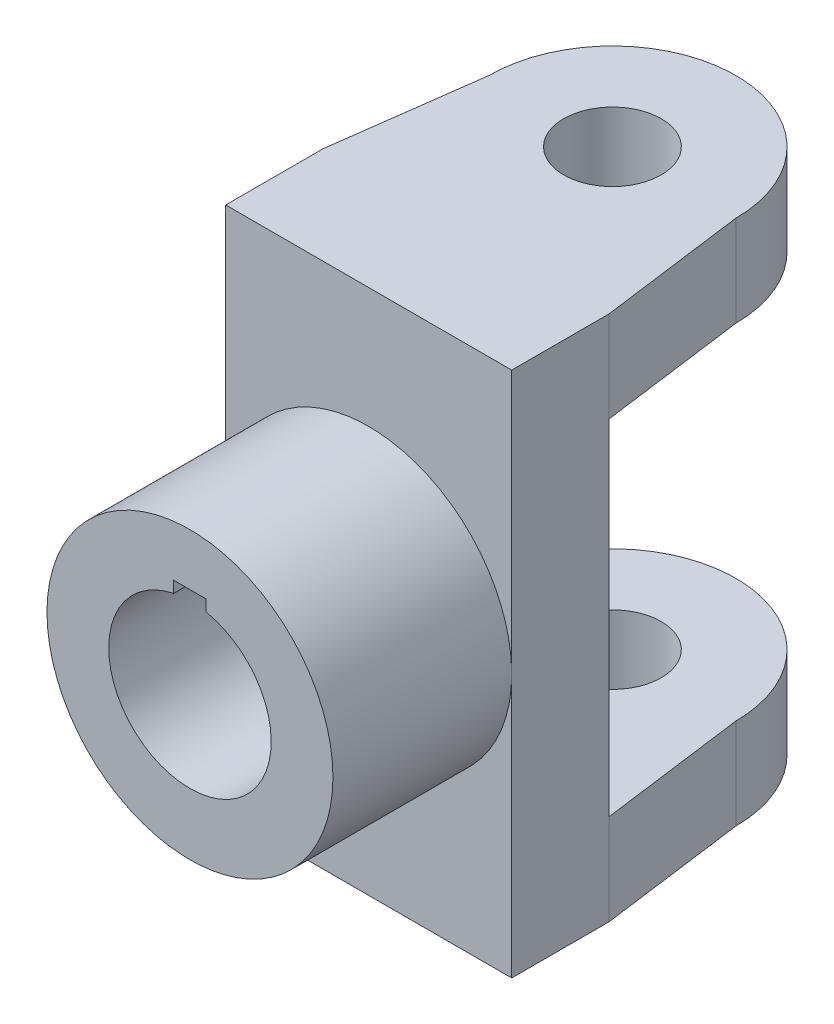
ISO-10303-21;
HEADER;
FILE_DESCRIPTION(('STEP AP214'),'2;1');
FILE_NAME('part.step','',(''),(''),'','','');
FILE_SCHEMA(('AUTOMOTIVE_DESIGN { 1 0 10303 214 1 1 1 1 }'));
ENDSEC;
DATA;
#1=APPLICATION_CONTEXT('core data for automotive mechanical design processes');
#2=APPLICATION_PROTOCOL_DEFINITION('international standard','automotive_design',2000,#1);
#3=PRODUCT_CONTEXT('',#1,'mechanical');
#4=PRODUCT('Part','Part','',(#3));
#5=PRODUCT_RELATED_PRODUCT_CATEGORY('part','',(#4));
#6=PRODUCT_DEFINITION_FORMATION('','',#4);
#7=PRODUCT_DEFINITION_CONTEXT('part definition',#1,'design');
#8=PRODUCT_DEFINITION('design','',#6,#7);
#9=PRODUCT_DEFINITION_SHAPE('','',#8);
#10=(LENGTH_UNIT() NAMED_UNIT(*) SI_UNIT(.MILLI.,.METRE.));
#11=(NAMED_UNIT(*) PLANE_ANGLE_UNIT() SI_UNIT($,.RADIAN.));
#12=(NAMED_UNIT(*) SI_UNIT($,.STERADIAN.) SOLID_ANGLE_UNIT());
#13=UNCERTAINTY_MEASURE_WITH_UNIT(LENGTH_MEASURE(1.E-05),#10,'distance_accuracy_value','');
#14=(GEOMETRIC_REPRESENTATION_CONTEXT(3) GLOBAL_UNCERTAINTY_ASSIGNED_CONTEXT((#13)) GLOBAL_UNIT_ASSIGNED_CONTEXT((#10,
#11,#12)) REPRESENTATION_CONTEXT('',''));
#15=CARTESIAN_POINT('',(0.,0.,0.));
#16=DIRECTION('',(0.,0.,1.));
#17=DIRECTION('',(1.,0.,0.));
#18=AXIS2_PLACEMENT_3D('',#15,#16,#17);
#19=CARTESIAN_POINT('',(0.,0.,0.));
#20=DIRECTION('',(0.,0.,1.));
#21=DIRECTION('',(1.,0.,0.));
#22=AXIS2_PLACEMENT_3D('',#19,#20,#21);
#23=PLANE('',#22);
#24=DIRECTION('',(-1.,0.,0.));
#25=VECTOR('',#24,1.);
#26=CARTESIAN_POINT('',(-44.,53.,0.));
#27=LINE('',#26,#25);
#28=CARTESIAN_POINT('',(44.,53.,0.));
#29=VERTEX_POINT('',#28);
#30=CARTESIAN_POINT('',(-44.,53.,0.));
#31=VERTEX_POINT('',#30);
#32=EDGE_CURVE('E165',#29,#31,#27,.T.);
#33=ORIENTED_EDGE('',*,*,#32,.F.);
#34=DIRECTION('',(0.,1.,0.));
#35=VECTOR('',#34,1.);
#36=CARTESIAN_POINT('',(44.,81.,0.));
#37=LINE('',#36,#35);
#38=CARTESIAN_POINT('',(44.,-53.,0.));
#39=VERTEX_POINT('',#38);
#40=EDGE_CURVE('E251',#39,#29,#37,.T.);
#41=ORIENTED_EDGE('',*,*,#40,.F.);
#42=DIRECTION('',(-1.,0.,0.));
#43=VECTOR('',#42,1.);
#44=CARTESIAN_POINT('',(-44.,-53.,0.));
#45=LINE('',#44,#43);
#46=CARTESIAN_POINT('',(-44.,-53.,0.));
#47=VERTEX_POINT('',#46);
#48=EDGE_CURVE('E196',#39,#47,#45,.T.);
#49=ORIENTED_EDGE('',*,*,#48,.T.);
#50=DIRECTION('',(0.,-1.,0.));
#51=VECTOR('',#50,1.);
#52=CARTESIAN_POINT('',(-44.,81.,0.));
#53=LINE('',#52,#51);
#54=EDGE_CURVE('E62',#31,#47,#53,.T.);
#55=ORIENTED_EDGE('',*,*,#54,.F.);
#56=EDGE_LOOP('',(#33,#41,#49,#55));
#57=FACE_BOUND('',#56,.T.);
#58=ADVANCED_FACE('F37',(#57),#23,.F.);
#59=CARTESIAN_POINT('',(0.,0.,30.));
#60=DIRECTION('',(0.,0.,1.));
#61=DIRECTION('',(1.,0.,0.));
#62=AXIS2_PLACEMENT_3D('',#59,#60,#61);
#63=PLANE('',#62);
#64=CARTESIAN_POINT('',(0.,0.,30.));
#65=DIRECTION('',(0.,0.,1.));
#66=DIRECTION('',(1.,0.,0.));
#67=AXIS2_PLACEMENT_3D('',#64,#65,#66);
#68=CIRCLE('',#67,44.);
#69=CARTESIAN_POINT('',(44.,0.,30.));
#70=VERTEX_POINT('',#69);
#71=CARTESIAN_POINT('',(-44.,0.,30.));
#72=VERTEX_POINT('',#71);
#73=EDGE_CURVE('E47',#70,#72,#68,.T.);
#74=ORIENTED_EDGE('',*,*,#73,.F.);
#75=DIRECTION('',(0.,1.,0.));
#76=VECTOR('',#75,1.);
#77=CARTESIAN_POINT('',(44.,81.,30.));
#78=LINE('',#77,#76);
#79=CARTESIAN_POINT('',(44.,81.,30.));
#80=VERTEX_POINT('',#79);
#81=EDGE_CURVE('E257',#70,#80,#78,.T.);
#82=ORIENTED_EDGE('',*,*,#81,.T.);
#83=DIRECTION('',(-1.,0.,0.));
#84=VECTOR('',#83,1.);
#85=CARTESIAN_POINT('',(-44.,81.,30.));
#86=LINE('',#85,#84);
#87=CARTESIAN_POINT('',(-44.,81.,30.));
#88=VERTEX_POINT('',#87);
#89=EDGE_CURVE('E256',#80,#88,#86,.T.);
#90=ORIENTED_EDGE('',*,*,#89,.T.);
#91=DIRECTION('',(0.,-1.,0.));
#92=VECTOR('',#91,1.);
#93=CARTESIAN_POINT('',(-44.,81.,30.));
#94=LINE('',#93,#92);
#95=EDGE_CURVE('E260',#88,#72,#94,.T.);
#96=ORIENTED_EDGE('',*,*,#95,.T.);
#97=EDGE_LOOP('',(#74,#82,#90,#96));
#98=FACE_BOUND('',#97,.T.);
#99=ADVANCED_FACE('F298',(#98),#63,.T.);
#100=CARTESIAN_POINT('',(44.,81.,30.));
#101=DIRECTION('',(-1.,0.,0.));
#102=DIRECTION('',(0.,-1.,0.));
#103=AXIS2_PLACEMENT_3D('',#100,#101,#102);
#104=PLANE('',#103);
#105=CARTESIAN_POINT('',(44.,-81.,0.));
#106=VERTEX_POINT('',#105);
#107=EDGE_CURVE('E266',#106,#39,#37,.T.);
#108=ORIENTED_EDGE('',*,*,#107,.T.);
#109=ORIENTED_EDGE('',*,*,#40,.T.);
#110=DIRECTION('',(0.,1.,0.));
#111=VECTOR('',#110,1.);
#112=CARTESIAN_POINT('',(44.,53.,0.));
#113=LINE('',#112,#111);
#114=CARTESIAN_POINT('',(44.,81.,0.));
#115=VERTEX_POINT('',#114);
#116=EDGE_CURVE('E169',#29,#115,#113,.T.);
#117=ORIENTED_EDGE('',*,*,#116,.T.);
#118=DIRECTION('',(0.,0.,-1.));
#119=VECTOR('',#118,1.);
#120=CARTESIAN_POINT('',(44.,81.,30.));
#121=LINE('',#120,#119);
#122=EDGE_CURVE('E41',#80,#115,#121,.T.);
#123=ORIENTED_EDGE('',*,*,#122,.F.);
#124=ORIENTED_EDGE('',*,*,#81,.F.);
#125=CARTESIAN_POINT('',(44.,-81.,30.));
#126=VERTEX_POINT('',#125);
#127=EDGE_CURVE('E254',#126,#70,#78,.T.);
#128=ORIENTED_EDGE('',*,*,#127,.F.);
#129=DIRECTION('',(0.,0.,-1.));
#130=VECTOR('',#129,1.);
#131=CARTESIAN_POINT('',(44.,-81.,30.));
#132=LINE('',#131,#130);
#133=EDGE_CURVE('E265',#126,#106,#132,.T.);
#134=ORIENTED_EDGE('',*,*,#133,.T.);
#135=EDGE_LOOP('',(#108,#109,#117,#123,#124,#128,#134));
#136=FACE_BOUND('',#135,.T.);
#137=ADVANCED_FACE('F39',(#136),#104,.F.);
#138=CARTESIAN_POINT('',(-44.,81.,30.));
#139=DIRECTION('',(0.,-1.,0.));
#140=DIRECTION('',(0.,0.,-1.));
#141=AXIS2_PLACEMENT_3D('',#138,#139,#140);
#142=PLANE('',#141);
#143=ORIENTED_EDGE('',*,*,#122,.T.);
#144=DIRECTION('',(0.132163720091018,0.,0.991227900682635));
#145=VECTOR('',#144,1.);
#146=CARTESIAN_POINT('',(44.,81.,0.));
#147=LINE('',#146,#145);
#148=CARTESIAN_POINT('',(38.,81.,-45.));
#149=VERTEX_POINT('',#148);
#150=EDGE_CURVE('E180',#149,#115,#147,.T.);
#151=ORIENTED_EDGE('',*,*,#150,.F.);
#152=CARTESIAN_POINT('',(0.,81.,-45.));
#153=DIRECTION('',(0.,-1.,0.));
#154=DIRECTION('',(0.,0.,-1.));
#155=AXIS2_PLACEMENT_3D('',#152,#153,#154);
#156=CIRCLE('',#155,38.);
#157=CARTESIAN_POINT('',(-38.,81.,-45.));
#158=VERTEX_POINT('',#157);
#159=EDGE_CURVE('E161',#158,#149,#156,.T.);
#160=ORIENTED_EDGE('',*,*,#159,.F.);
#161=DIRECTION('',(0.132163720091018,0.,-0.991227900682635));
#162=VECTOR('',#161,1.);
#163=CARTESIAN_POINT('',(-44.,81.,0.));
#164=LINE('',#163,#162);
#165=CARTESIAN_POINT('',(-44.,81.,0.));
#166=VERTEX_POINT('',#165);
#167=EDGE_CURVE('E171',#166,#158,#164,.T.);
#168=ORIENTED_EDGE('',*,*,#167,.F.);
#169=DIRECTION('',(0.,0.,-1.));
#170=VECTOR('',#169,1.);
#171=CARTESIAN_POINT('',(-44.,81.,30.));
#172=LINE('',#171,#170);
#173=EDGE_CURVE('E275',#88,#166,#172,.T.);
#174=ORIENTED_EDGE('',*,*,#173,.F.);
#175=ORIENTED_EDGE('',*,*,#89,.F.);
#176=EDGE_LOOP('',(#143,#151,#160,#168,#174,#175));
#177=FACE_BOUND('',#176,.T.);
#178=CARTESIAN_POINT('',(0.,81.,-45.));
#179=DIRECTION('',(0.,-1.,0.));
#180=DIRECTION('',(0.,0.,-1.));
#181=AXIS2_PLACEMENT_3D('',#178,#179,#180);
#182=CIRCLE('',#181,15.);
#183=CARTESIAN_POINT('',(0.,81.,-60.));
#184=VERTEX_POINT('',#183);
#185=EDGE_CURVE('E175',#184,#184,#182,.T.);
#186=ORIENTED_EDGE('',*,*,#185,.T.);
#187=EDGE_LOOP('',(#186));
#188=FACE_BOUND('',#187,.T.);
#189=ADVANCED_FACE('F283',(#177,#188),#142,.F.);
#190=CARTESIAN_POINT('',(-44.,81.,30.));
#191=DIRECTION('',(1.,0.,0.));
#192=DIRECTION('',(0.,1.,0.));
#193=AXIS2_PLACEMENT_3D('',#190,#191,#192);
#194=PLANE('',#193);
#195=EDGE_CURVE('E269',#166,#31,#53,.T.);
#196=ORIENTED_EDGE('',*,*,#195,.T.);
#197=ORIENTED_EDGE('',*,*,#54,.T.);
#198=DIRECTION('',(0.,-1.,0.));
#199=VECTOR('',#198,1.);
#200=CARTESIAN_POINT('',(-44.,-53.,0.));
#201=LINE('',#200,#199);
#202=CARTESIAN_POINT('',(-44.,-81.,0.));
#203=VERTEX_POINT('',#202);
#204=EDGE_CURVE('E206',#47,#203,#201,.T.);
#205=ORIENTED_EDGE('',*,*,#204,.T.);
#206=DIRECTION('',(0.,0.,-1.));
#207=VECTOR('',#206,1.);
#208=CARTESIAN_POINT('',(-44.,-81.,30.));
#209=LINE('',#208,#207);
#210=CARTESIAN_POINT('',(-44.,-81.,30.));
#211=VERTEX_POINT('',#210);
#212=EDGE_CURVE('E273',#211,#203,#209,.T.);
#213=ORIENTED_EDGE('',*,*,#212,.F.);
#214=EDGE_CURVE('E259',#72,#211,#94,.T.);
#215=ORIENTED_EDGE('',*,*,#214,.F.);
#216=ORIENTED_EDGE('',*,*,#95,.F.);
#217=ORIENTED_EDGE('',*,*,#173,.T.);
#218=EDGE_LOOP('',(#196,#197,#205,#213,#215,#216,#217));
#219=FACE_BOUND('',#218,.T.);
#220=ADVANCED_FACE('F292',(#219),#194,.F.);
#221=CARTESIAN_POINT('',(-44.,-81.,30.));
#222=DIRECTION('',(0.,1.,0.));
#223=DIRECTION('',(0.,0.,1.));
#224=AXIS2_PLACEMENT_3D('',#221,#222,#223);
#225=PLANE('',#224);
#226=ORIENTED_EDGE('',*,*,#212,.T.);
#227=DIRECTION('',(0.132163720091018,0.,-0.991227900682635));
#228=VECTOR('',#227,1.);
#229=CARTESIAN_POINT('',(-44.,-81.,0.));
#230=LINE('',#229,#228);
#231=CARTESIAN_POINT('',(-38.,-81.,-45.));
#232=VERTEX_POINT('',#231);
#233=EDGE_CURVE('E209',#203,#232,#230,.T.);
#234=ORIENTED_EDGE('',*,*,#233,.T.);
#235=CARTESIAN_POINT('',(0.,-81.,-45.));
#236=DIRECTION('',(0.,-1.,0.));
#237=DIRECTION('',(0.,0.,-1.));
#238=AXIS2_PLACEMENT_3D('',#235,#236,#237);
#239=CIRCLE('',#238,38.);
#240=CARTESIAN_POINT('',(38.,-81.,-45.));
#241=VERTEX_POINT('',#240);
#242=EDGE_CURVE('E197',#232,#241,#239,.T.);
#243=ORIENTED_EDGE('',*,*,#242,.T.);
#244=DIRECTION('',(0.132163720091018,0.,0.991227900682635));
#245=VECTOR('',#244,1.);
#246=CARTESIAN_POINT('',(44.,-81.,0.));
#247=LINE('',#246,#245);
#248=EDGE_CURVE('E190',#241,#106,#247,.T.);
#249=ORIENTED_EDGE('',*,*,#248,.T.);
#250=ORIENTED_EDGE('',*,*,#133,.F.);
#251=DIRECTION('',(1.,0.,0.));
#252=VECTOR('',#251,1.);
#253=CARTESIAN_POINT('',(-44.,-81.,30.));
#254=LINE('',#253,#252);
#255=EDGE_CURVE('E263',#211,#126,#254,.T.);
#256=ORIENTED_EDGE('',*,*,#255,.F.);
#257=EDGE_LOOP('',(#226,#234,#243,#249,#250,#256));
#258=FACE_BOUND('',#257,.T.);
#259=CARTESIAN_POINT('',(0.,-81.,-45.));
#260=DIRECTION('',(0.,-1.,0.));
#261=DIRECTION('',(0.,0.,-1.));
#262=AXIS2_PLACEMENT_3D('',#259,#260,#261);
#263=CIRCLE('',#262,15.);
#264=CARTESIAN_POINT('',(0.,-81.,-60.));
#265=VERTEX_POINT('',#264);
#266=EDGE_CURVE('E185',#265,#265,#263,.T.);
#267=ORIENTED_EDGE('',*,*,#266,.F.);
#268=EDGE_LOOP('',(#267));
#269=FACE_BOUND('',#268,.T.);
#270=ADVANCED_FACE('F306',(#258,#269),#225,.F.);
#271=EDGE_CURVE('E11',#72,#70,#68,.T.);
#272=ORIENTED_EDGE('',*,*,#271,.F.);
#273=ORIENTED_EDGE('',*,*,#214,.T.);
#274=ORIENTED_EDGE('',*,*,#255,.T.);
#275=ORIENTED_EDGE('',*,*,#127,.T.);
#276=EDGE_LOOP('',(#272,#273,#274,#275));
#277=FACE_BOUND('',#276,.T.);
#278=ADVANCED_FACE('F302',(#277),#63,.T.);
#279=CARTESIAN_POINT('',(0.,0.,85.));
#280=DIRECTION('',(0.,0.,1.));
#281=DIRECTION('',(1.,0.,0.));
#282=AXIS2_PLACEMENT_3D('',#279,#280,#281);
#283=PLANE('',#282);
#284=CARTESIAN_POINT('',(0.,0.,85.));
#285=DIRECTION('',(0.,0.,1.));
#286=DIRECTION('',(1.,0.,0.));
#287=AXIS2_PLACEMENT_3D('',#284,#285,#286);
#288=CIRCLE('',#287,44.);
#289=CARTESIAN_POINT('',(44.,0.,85.));
#290=VERTEX_POINT('',#289);
#291=EDGE_CURVE('E249',#290,#290,#288,.T.);
#292=ORIENTED_EDGE('',*,*,#291,.T.);
#293=EDGE_LOOP('',(#292));
#294=FACE_BOUND('',#293,.T.);
#295=DIRECTION('',(0.,1.,0.));
#296=VECTOR('',#295,1.);
#297=CARTESIAN_POINT('',(5.,28.,85.));
#298=LINE('',#297,#296);
#299=CARTESIAN_POINT('',(5.,24.4948974278318,85.));
#300=VERTEX_POINT('',#299);
#301=CARTESIAN_POINT('',(5.,28.,85.));
#302=VERTEX_POINT('',#301);
#303=EDGE_CURVE('E222',#300,#302,#298,.T.);
#304=ORIENTED_EDGE('',*,*,#303,.F.);
#305=CARTESIAN_POINT('',(0.,0.,85.));
#306=DIRECTION('',(0.,0.,1.));
#307=DIRECTION('',(1.,0.,0.));
#308=AXIS2_PLACEMENT_3D('',#305,#306,#307);
#309=CIRCLE('',#308,25.);
#310=CARTESIAN_POINT('',(-5.,24.4948974278318,85.));
#311=VERTEX_POINT('',#310);
#312=EDGE_CURVE('E220',#311,#300,#309,.T.);
#313=ORIENTED_EDGE('',*,*,#312,.F.);
#314=DIRECTION('',(0.,-1.,0.));
#315=VECTOR('',#314,1.);
#316=CARTESIAN_POINT('',(-5.,24.4948974278318,85.));
#317=LINE('',#316,#315);
#318=CARTESIAN_POINT('',(-5.,28.,85.));
#319=VERTEX_POINT('',#318);
#320=EDGE_CURVE('E228',#319,#311,#317,.T.);
#321=ORIENTED_EDGE('',*,*,#320,.F.);
#322=DIRECTION('',(-1.,0.,0.));
#323=VECTOR('',#322,1.);
#324=CARTESIAN_POINT('',(-5.,28.,85.));
#325=LINE('',#324,#323);
#326=EDGE_CURVE('E225',#302,#319,#325,.T.);
#327=ORIENTED_EDGE('',*,*,#326,.F.);
#328=EDGE_LOOP('',(#304,#313,#321,#327));
#329=FACE_BOUND('',#328,.T.);
#330=ADVANCED_FACE('F365',(#294,#329),#283,.T.);
#331=CARTESIAN_POINT('',(0.,0.,85.));
#332=DIRECTION('',(0.,0.,-1.));
#333=DIRECTION('',(-1.,0.,0.));
#334=AXIS2_PLACEMENT_3D('',#331,#332,#333);
#335=CYLINDRICAL_SURFACE('',#334,44.);
#336=ORIENTED_EDGE('',*,*,#291,.F.);
#337=EDGE_LOOP('',(#336));
#338=FACE_BOUND('',#337,.T.);
#339=ORIENTED_EDGE('',*,*,#73,.T.);
#340=ORIENTED_EDGE('',*,*,#271,.T.);
#341=EDGE_LOOP('',(#339,#340));
#342=FACE_BOUND('',#341,.T.);
#343=ADVANCED_FACE('F300',(#338,#342),#335,.T.);
#344=CARTESIAN_POINT('',(0.,0.,85.));
#345=DIRECTION('',(0.,0.,-1.));
#346=DIRECTION('',(-1.,0.,0.));
#347=AXIS2_PLACEMENT_3D('',#344,#345,#346);
#348=CYLINDRICAL_SURFACE('',#347,25.);
#349=CARTESIAN_POINT('',(0.,0.,30.));
#350=DIRECTION('',(0.,0.,1.));
#351=DIRECTION('',(1.,0.,0.));
#352=AXIS2_PLACEMENT_3D('',#349,#350,#351);
#353=CIRCLE('',#352,25.);
#354=CARTESIAN_POINT('',(-5.,24.4948974278318,30.));
#355=VERTEX_POINT('',#354);
#356=CARTESIAN_POINT('',(5.,24.4948974278318,30.));
#357=VERTEX_POINT('',#356);
#358=EDGE_CURVE('E216',#355,#357,#353,.T.);
#359=ORIENTED_EDGE('',*,*,#358,.F.);
#360=DIRECTION('',(0.,0.,-1.));
#361=VECTOR('',#360,1.);
#362=CARTESIAN_POINT('',(-5.,24.4948974278318,85.));
#363=LINE('',#362,#361);
#364=EDGE_CURVE('E230',#311,#355,#363,.T.);
#365=ORIENTED_EDGE('',*,*,#364,.F.);
#366=ORIENTED_EDGE('',*,*,#312,.T.);
#367=DIRECTION('',(0.,0.,-1.));
#368=VECTOR('',#367,1.);
#369=CARTESIAN_POINT('',(5.,24.4948974278318,85.));
#370=LINE('',#369,#368);
#371=EDGE_CURVE('E246',#300,#357,#370,.T.);
#372=ORIENTED_EDGE('',*,*,#371,.T.);
#373=EDGE_LOOP('',(#359,#365,#366,#372));
#374=FACE_BOUND('',#373,.T.);
#375=ADVANCED_FACE('F382',(#374),#348,.F.);
#376=CARTESIAN_POINT('',(5.,28.,85.));
#377=DIRECTION('',(-1.,0.,0.));
#378=DIRECTION('',(0.,0.,1.));
#379=AXIS2_PLACEMENT_3D('',#376,#377,#378);
#380=PLANE('',#379);
#381=DIRECTION('',(0.,1.,0.));
#382=VECTOR('',#381,1.);
#383=CARTESIAN_POINT('',(5.,28.,30.));
#384=LINE('',#383,#382);
#385=CARTESIAN_POINT('',(5.,28.,30.));
#386=VERTEX_POINT('',#385);
#387=EDGE_CURVE('E233',#357,#386,#384,.T.);
#388=ORIENTED_EDGE('',*,*,#387,.F.);
#389=ORIENTED_EDGE('',*,*,#371,.F.);
#390=ORIENTED_EDGE('',*,*,#303,.T.);
#391=DIRECTION('',(0.,0.,-1.));
#392=VECTOR('',#391,1.);
#393=CARTESIAN_POINT('',(5.,28.,85.));
#394=LINE('',#393,#392);
#395=EDGE_CURVE('E244',#302,#386,#394,.T.);
#396=ORIENTED_EDGE('',*,*,#395,.T.);
#397=EDGE_LOOP('',(#388,#389,#390,#396));
#398=FACE_BOUND('',#397,.T.);
#399=ADVANCED_FACE('F391',(#398),#380,.T.);
#400=CARTESIAN_POINT('',(-5.,28.,85.));
#401=DIRECTION('',(0.,-1.,0.));
#402=DIRECTION('',(0.,0.,-1.));
#403=AXIS2_PLACEMENT_3D('',#400,#401,#402);
#404=PLANE('',#403);
#405=DIRECTION('',(-1.,0.,0.));
#406=VECTOR('',#405,1.);
#407=CARTESIAN_POINT('',(-5.,28.,30.));
#408=LINE('',#407,#406);
#409=CARTESIAN_POINT('',(-5.,28.,30.));
#410=VERTEX_POINT('',#409);
#411=EDGE_CURVE('E236',#386,#410,#408,.T.);
#412=ORIENTED_EDGE('',*,*,#411,.F.);
#413=ORIENTED_EDGE('',*,*,#395,.F.);
#414=ORIENTED_EDGE('',*,*,#326,.T.);
#415=DIRECTION('',(0.,0.,-1.));
#416=VECTOR('',#415,1.);
#417=CARTESIAN_POINT('',(-5.,28.,85.));
#418=LINE('',#417,#416);
#419=EDGE_CURVE('E242',#319,#410,#418,.T.);
#420=ORIENTED_EDGE('',*,*,#419,.T.);
#421=EDGE_LOOP('',(#412,#413,#414,#420));
#422=FACE_BOUND('',#421,.T.);
#423=ADVANCED_FACE('F401',(#422),#404,.T.);
#424=CARTESIAN_POINT('',(-5.,24.4948974278318,85.));
#425=DIRECTION('',(1.,0.,0.));
#426=DIRECTION('',(0.,0.,-1.));
#427=AXIS2_PLACEMENT_3D('',#424,#425,#426);
#428=PLANE('',#427);
#429=DIRECTION('',(0.,-1.,0.));
#430=VECTOR('',#429,1.);
#431=CARTESIAN_POINT('',(-5.,24.4948974278318,30.));
#432=LINE('',#431,#430);
#433=EDGE_CURVE('E223',#410,#355,#432,.T.);
#434=ORIENTED_EDGE('',*,*,#433,.F.);
#435=ORIENTED_EDGE('',*,*,#419,.F.);
#436=ORIENTED_EDGE('',*,*,#320,.T.);
#437=ORIENTED_EDGE('',*,*,#364,.T.);
#438=EDGE_LOOP('',(#434,#435,#436,#437));
#439=FACE_BOUND('',#438,.T.);
#440=ADVANCED_FACE('F411',(#439),#428,.T.);
#441=ORIENTED_EDGE('',*,*,#433,.T.);
#442=ORIENTED_EDGE('',*,*,#358,.T.);
#443=ORIENTED_EDGE('',*,*,#387,.T.);
#444=ORIENTED_EDGE('',*,*,#411,.T.);
#445=EDGE_LOOP('',(#441,#442,#443,#444));
#446=FACE_BOUND('',#445,.T.);
#447=ADVANCED_FACE('F338',(#446),#63,.T.);
#448=CARTESIAN_POINT('',(44.,-53.,0.));
#449=DIRECTION('',(0.991227900682635,0.,-0.132163720091018));
#450=DIRECTION('',(-0.132163720091018,0.,-0.991227900682635));
#451=AXIS2_PLACEMENT_3D('',#448,#449,#450);
#452=PLANE('',#451);
#453=ORIENTED_EDGE('',*,*,#248,.F.);
#454=DIRECTION('',(0.,-1.,0.));
#455=VECTOR('',#454,1.);
#456=CARTESIAN_POINT('',(38.,-53.,-45.));
#457=LINE('',#456,#455);
#458=CARTESIAN_POINT('',(38.,-53.,-45.));
#459=VERTEX_POINT('',#458);
#460=EDGE_CURVE('E214',#459,#241,#457,.T.);
#461=ORIENTED_EDGE('',*,*,#460,.F.);
#462=DIRECTION('',(0.132163720091018,0.,0.991227900682635));
#463=VECTOR('',#462,1.);
#464=CARTESIAN_POINT('',(44.,-53.,0.));
#465=LINE('',#464,#463);
#466=EDGE_CURVE('E193',#459,#39,#465,.T.);
#467=ORIENTED_EDGE('',*,*,#466,.T.);
#468=ORIENTED_EDGE('',*,*,#107,.F.);
#469=EDGE_LOOP('',(#453,#461,#467,#468));
#470=FACE_BOUND('',#469,.T.);
#471=ADVANCED_FACE('F311',(#470),#452,.T.);
#472=CARTESIAN_POINT('',(0.,-53.,-45.));
#473=DIRECTION('',(0.,-1.,0.));
#474=DIRECTION('',(0.,0.,-1.));
#475=AXIS2_PLACEMENT_3D('',#472,#473,#474);
#476=CYLINDRICAL_SURFACE('',#475,38.);
#477=ORIENTED_EDGE('',*,*,#242,.F.);
#478=DIRECTION('',(0.,-1.,0.));
#479=VECTOR('',#478,1.);
#480=CARTESIAN_POINT('',(-38.,-53.,-45.));
#481=LINE('',#480,#479);
#482=CARTESIAN_POINT('',(-38.,-53.,-45.));
#483=VERTEX_POINT('',#482);
#484=EDGE_CURVE('E217',#483,#232,#481,.T.);
#485=ORIENTED_EDGE('',*,*,#484,.F.);
#486=CARTESIAN_POINT('',(0.,-53.,-45.));
#487=DIRECTION('',(0.,-1.,0.));
#488=DIRECTION('',(0.,0.,-1.));
#489=AXIS2_PLACEMENT_3D('',#486,#487,#488);
#490=CIRCLE('',#489,38.);
#491=EDGE_CURVE('E203',#483,#459,#490,.T.);
#492=ORIENTED_EDGE('',*,*,#491,.T.);
#493=ORIENTED_EDGE('',*,*,#460,.T.);
#494=EDGE_LOOP('',(#477,#485,#492,#493));
#495=FACE_BOUND('',#494,.T.);
#496=ADVANCED_FACE('F317',(#495),#476,.T.);
#497=CARTESIAN_POINT('',(-44.,-53.,0.));
#498=DIRECTION('',(-0.991227900682635,0.,-0.132163720091018));
#499=DIRECTION('',(-0.132163720091018,0.,0.991227900682635));
#500=AXIS2_PLACEMENT_3D('',#497,#498,#499);
#501=PLANE('',#500);
#502=ORIENTED_EDGE('',*,*,#233,.F.);
#503=ORIENTED_EDGE('',*,*,#204,.F.);
#504=DIRECTION('',(0.132163720091018,0.,-0.991227900682635));
#505=VECTOR('',#504,1.);
#506=CARTESIAN_POINT('',(-44.,-53.,0.));
#507=LINE('',#506,#505);
#508=EDGE_CURVE('E200',#47,#483,#507,.T.);
#509=ORIENTED_EDGE('',*,*,#508,.T.);
#510=ORIENTED_EDGE('',*,*,#484,.T.);
#511=EDGE_LOOP('',(#502,#503,#509,#510));
#512=FACE_BOUND('',#511,.T.);
#513=ADVANCED_FACE('F320',(#512),#501,.T.);
#514=CARTESIAN_POINT('',(0.,-53.,-45.));
#515=DIRECTION('',(0.,-1.,0.));
#516=DIRECTION('',(0.,0.,-1.));
#517=AXIS2_PLACEMENT_3D('',#514,#515,#516);
#518=PLANE('',#517);
#519=CARTESIAN_POINT('',(0.,-53.,-45.));
#520=DIRECTION('',(0.,-1.,0.));
#521=DIRECTION('',(0.,0.,-1.));
#522=AXIS2_PLACEMENT_3D('',#519,#520,#521);
#523=CIRCLE('',#522,15.);
#524=CARTESIAN_POINT('',(0.,-53.,-60.));
#525=VERTEX_POINT('',#524);
#526=EDGE_CURVE('E187',#525,#525,#523,.T.);
#527=ORIENTED_EDGE('',*,*,#526,.T.);
#528=EDGE_LOOP('',(#527));
#529=FACE_BOUND('',#528,.T.);
#530=ORIENTED_EDGE('',*,*,#466,.F.);
#531=ORIENTED_EDGE('',*,*,#491,.F.);
#532=ORIENTED_EDGE('',*,*,#508,.F.);
#533=ORIENTED_EDGE('',*,*,#48,.F.);
#534=EDGE_LOOP('',(#530,#531,#532,#533));
#535=FACE_BOUND('',#534,.T.);
#536=ADVANCED_FACE('F315',(#529,#535),#518,.F.);
#537=CARTESIAN_POINT('',(0.,-53.,-45.));
#538=DIRECTION('',(0.,-1.,0.));
#539=DIRECTION('',(0.,0.,-1.));
#540=AXIS2_PLACEMENT_3D('',#537,#538,#539);
#541=CYLINDRICAL_SURFACE('',#540,15.);
#542=ORIENTED_EDGE('',*,*,#526,.F.);
#543=EDGE_LOOP('',(#542));
#544=FACE_BOUND('',#543,.T.);
#545=ORIENTED_EDGE('',*,*,#266,.T.);
#546=EDGE_LOOP('',(#545));
#547=FACE_BOUND('',#546,.T.);
#548=ADVANCED_FACE('F327',(#544,#547),#541,.F.);
#549=CARTESIAN_POINT('',(0.,53.,-45.));
#550=DIRECTION('',(0.,1.,0.));
#551=DIRECTION('',(0.,0.,-1.));
#552=AXIS2_PLACEMENT_3D('',#549,#550,#551);
#553=PLANE('',#552);
#554=DIRECTION('',(0.132163720091018,0.,0.991227900682635));
#555=VECTOR('',#554,1.);
#556=CARTESIAN_POINT('',(44.,53.,0.));
#557=LINE('',#556,#555);
#558=CARTESIAN_POINT('',(38.,53.,-45.));
#559=VERTEX_POINT('',#558);
#560=EDGE_CURVE('E152',#559,#29,#557,.T.);
#561=ORIENTED_EDGE('',*,*,#560,.T.);
#562=ORIENTED_EDGE('',*,*,#32,.T.);
#563=DIRECTION('',(0.132163720091018,0.,-0.991227900682635));
#564=VECTOR('',#563,1.);
#565=CARTESIAN_POINT('',(-44.,53.,0.));
#566=LINE('',#565,#564);
#567=CARTESIAN_POINT('',(-38.,53.,-45.));
#568=VERTEX_POINT('',#567);
#569=EDGE_CURVE('E54',#31,#568,#566,.T.);
#570=ORIENTED_EDGE('',*,*,#569,.T.);
#571=CARTESIAN_POINT('',(0.,53.,-45.));
#572=DIRECTION('',(0.,-1.,0.));
#573=DIRECTION('',(0.,0.,-1.));
#574=AXIS2_PLACEMENT_3D('',#571,#572,#573);
#575=CIRCLE('',#574,38.);
#576=EDGE_CURVE('E147',#568,#559,#575,.T.);
#577=ORIENTED_EDGE('',*,*,#576,.T.);
#578=EDGE_LOOP('',(#561,#562,#570,#577));
#579=FACE_BOUND('',#578,.T.);
#580=CARTESIAN_POINT('',(0.,53.,-45.));
#581=DIRECTION('',(0.,-1.,0.));
#582=DIRECTION('',(0.,0.,-1.));
#583=AXIS2_PLACEMENT_3D('',#580,#581,#582);
#584=CIRCLE('',#583,15.);
#585=CARTESIAN_POINT('',(0.,53.,-60.));
#586=VERTEX_POINT('',#585);
#587=EDGE_CURVE('E182',#586,#586,#584,.T.);
#588=ORIENTED_EDGE('',*,*,#587,.F.);
#589=EDGE_LOOP('',(#588));
#590=FACE_BOUND('',#589,.T.);
#591=ADVANCED_FACE('F149',(#579,#590),#553,.F.);
#592=CARTESIAN_POINT('',(44.,53.,0.));
#593=DIRECTION('',(-0.991227900682635,0.,0.132163720091018));
#594=DIRECTION('',(0.132163720091018,0.,0.991227900682635));
#595=AXIS2_PLACEMENT_3D('',#592,#593,#594);
#596=PLANE('',#595);
#597=ORIENTED_EDGE('',*,*,#150,.T.);
#598=ORIENTED_EDGE('',*,*,#116,.F.);
#599=ORIENTED_EDGE('',*,*,#560,.F.);
#600=DIRECTION('',(0.,1.,0.));
#601=VECTOR('',#600,1.);
#602=CARTESIAN_POINT('',(38.,53.,-45.));
#603=LINE('',#602,#601);
#604=EDGE_CURVE('E158',#559,#149,#603,.T.);
#605=ORIENTED_EDGE('',*,*,#604,.T.);
#606=EDGE_LOOP('',(#597,#598,#599,#605));
#607=FACE_BOUND('',#606,.T.);
#608=ADVANCED_FACE('F167',(#607),#596,.F.);
#609=CARTESIAN_POINT('',(-44.,53.,0.));
#610=DIRECTION('',(0.991227900682635,0.,0.132163720091018));
#611=DIRECTION('',(0.132163720091018,0.,-0.991227900682635));
#612=AXIS2_PLACEMENT_3D('',#609,#610,#611);
#613=PLANE('',#612);
#614=ORIENTED_EDGE('',*,*,#167,.T.);
#615=DIRECTION('',(0.,1.,0.));
#616=VECTOR('',#615,1.);
#617=CARTESIAN_POINT('',(-38.,53.,-45.));
#618=LINE('',#617,#616);
#619=EDGE_CURVE('E164',#568,#158,#618,.T.);
#620=ORIENTED_EDGE('',*,*,#619,.F.);
#621=ORIENTED_EDGE('',*,*,#569,.F.);
#622=ORIENTED_EDGE('',*,*,#195,.F.);
#623=EDGE_LOOP('',(#614,#620,#621,#622));
#624=FACE_BOUND('',#623,.T.);
#625=ADVANCED_FACE('F294',(#624),#613,.F.);
#626=CARTESIAN_POINT('',(0.,53.,-45.));
#627=DIRECTION('',(0.,1.,0.));
#628=DIRECTION('',(0.,0.,1.));
#629=AXIS2_PLACEMENT_3D('',#626,#627,#628);
#630=CYLINDRICAL_SURFACE('',#629,38.);
#631=ORIENTED_EDGE('',*,*,#159,.T.);
#632=ORIENTED_EDGE('',*,*,#604,.F.);
#633=ORIENTED_EDGE('',*,*,#576,.F.);
#634=ORIENTED_EDGE('',*,*,#619,.T.);
#635=EDGE_LOOP('',(#631,#632,#633,#634));
#636=FACE_BOUND('',#635,.T.);
#637=ADVANCED_FACE('F159',(#636),#630,.T.);
#638=CARTESIAN_POINT('',(0.,53.,-45.));
#639=DIRECTION('',(0.,1.,0.));
#640=DIRECTION('',(0.,0.,1.));
#641=AXIS2_PLACEMENT_3D('',#638,#639,#640);
#642=CYLINDRICAL_SURFACE('',#641,15.);
#643=ORIENTED_EDGE('',*,*,#587,.T.);
#644=EDGE_LOOP('',(#643));
#645=FACE_BOUND('',#644,.T.);
#646=ORIENTED_EDGE('',*,*,#185,.F.);
#647=EDGE_LOOP('',(#646));
#648=FACE_BOUND('',#647,.T.);
#649=ADVANCED_FACE('F510',(#645,#648),#642,.F.);
#650=CLOSED_SHELL('',(#58,#99,#137,#189,#220,#270,#278,#330,#343,#375,#399,#423,#440,#447,#471,
#496,#513,#536,#548,#591,#608,#625,#637,#649));
#651=MANIFOLD_SOLID_BREP('B2',#650);
#652=ADVANCED_BREP_SHAPE_REPRESENTATION('',(#18,#651),#14);
#653=SHAPE_DEFINITION_REPRESENTATION(#9,#652);
ENDSEC;
END-ISO-10303-21;
